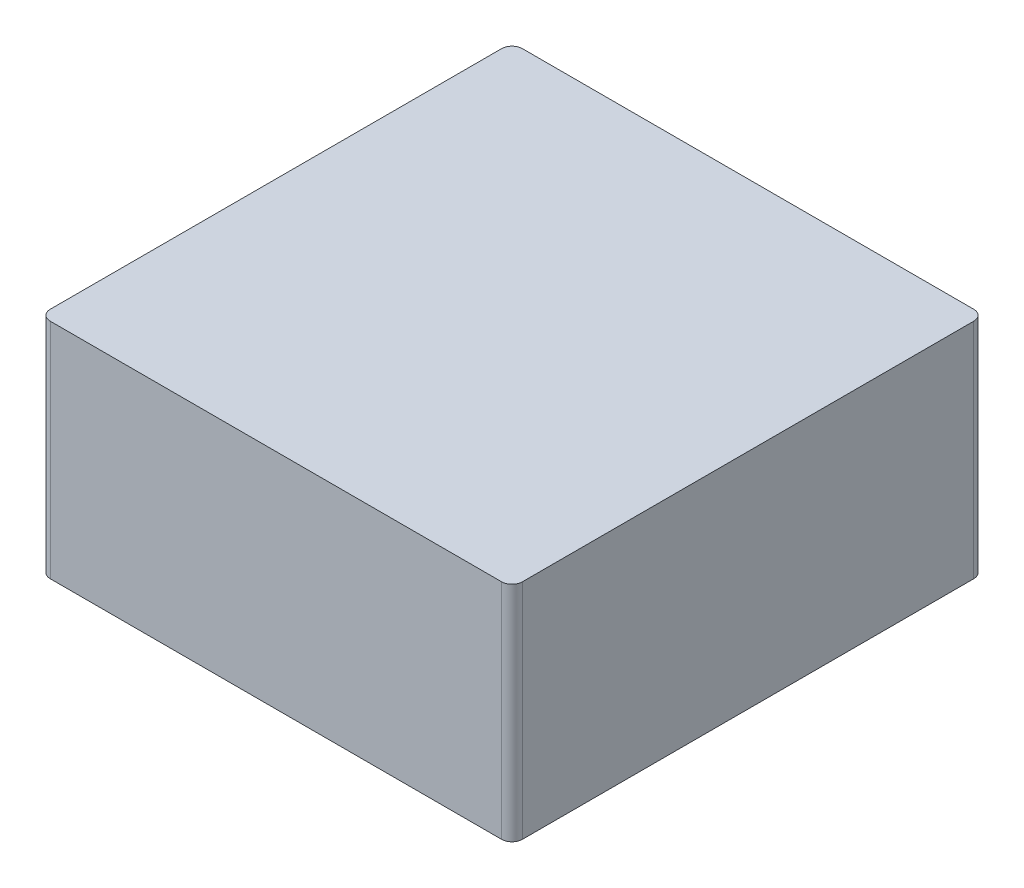
ISO-10303-21;
HEADER;
FILE_DESCRIPTION(('STEP AP214'),'2;1');
FILE_NAME('part.step','',(''),(''),'','','');
FILE_SCHEMA(('AUTOMOTIVE_DESIGN { 1 0 10303 214 1 1 1 1 }'));
ENDSEC;
DATA;
#1=APPLICATION_CONTEXT('core data for automotive mechanical design processes');
#2=APPLICATION_PROTOCOL_DEFINITION('international standard','automotive_design',2000,#1);
#3=PRODUCT_CONTEXT('',#1,'mechanical');
#4=PRODUCT('Part','Part','',(#3));
#5=PRODUCT_RELATED_PRODUCT_CATEGORY('part','',(#4));
#6=PRODUCT_DEFINITION_FORMATION('','',#4);
#7=PRODUCT_DEFINITION_CONTEXT('part definition',#1,'design');
#8=PRODUCT_DEFINITION('design','',#6,#7);
#9=PRODUCT_DEFINITION_SHAPE('','',#8);
#10=(LENGTH_UNIT() NAMED_UNIT(*) SI_UNIT(.MILLI.,.METRE.));
#11=(NAMED_UNIT(*) PLANE_ANGLE_UNIT() SI_UNIT($,.RADIAN.));
#12=(NAMED_UNIT(*) SI_UNIT($,.STERADIAN.) SOLID_ANGLE_UNIT());
#13=UNCERTAINTY_MEASURE_WITH_UNIT(LENGTH_MEASURE(1.E-05),#10,'distance_accuracy_value','');
#14=(GEOMETRIC_REPRESENTATION_CONTEXT(3) GLOBAL_UNCERTAINTY_ASSIGNED_CONTEXT((#13)) GLOBAL_UNIT_ASSIGNED_CONTEXT((#10,
#11,#12)) REPRESENTATION_CONTEXT('',''));
#15=CARTESIAN_POINT('',(0.,0.,0.));
#16=DIRECTION('',(0.,0.,1.));
#17=DIRECTION('',(1.,0.,0.));
#18=AXIS2_PLACEMENT_3D('',#15,#16,#17);
#19=CARTESIAN_POINT('',(0.,0.,0.));
#20=DIRECTION('',(0.,1.,0.));
#21=DIRECTION('',(0.,0.,1.));
#22=AXIS2_PLACEMENT_3D('',#19,#20,#21);
#23=PLANE('',#22);
#24=DIRECTION('',(0.,0.,1.));
#25=VECTOR('',#24,1.);
#26=CARTESIAN_POINT('',(-88.,0.,-88.));
#27=LINE('',#26,#25);
#28=CARTESIAN_POINT('',(-88.,0.,-86.));
#29=VERTEX_POINT('',#28);
#30=CARTESIAN_POINT('',(-88.,0.,1.));
#31=VERTEX_POINT('',#30);
#32=EDGE_CURVE('E258',#29,#31,#27,.T.);
#33=ORIENTED_EDGE('',*,*,#32,.F.);
#34=CARTESIAN_POINT('',(-86.,0.,-86.));
#35=DIRECTION('',(0.,1.,0.));
#36=DIRECTION('',(0.,0.,1.));
#37=AXIS2_PLACEMENT_3D('',#34,#35,#36);
#38=CIRCLE('',#37,2.);
#39=CARTESIAN_POINT('',(-86.,0.,-88.));
#40=VERTEX_POINT('',#39);
#41=EDGE_CURVE('E442',#29,#40,#38,.F.);
#42=ORIENTED_EDGE('',*,*,#41,.T.);
#43=DIRECTION('',(-1.,0.,0.));
#44=VECTOR('',#43,1.);
#45=CARTESIAN_POINT('',(3.,0.,-88.));
#46=LINE('',#45,#44);
#47=CARTESIAN_POINT('',(1.,0.,-88.));
#48=VERTEX_POINT('',#47);
#49=EDGE_CURVE('E190',#48,#40,#46,.T.);
#50=ORIENTED_EDGE('',*,*,#49,.F.);
#51=CARTESIAN_POINT('',(1.,0.,-86.));
#52=DIRECTION('',(0.,1.,0.));
#53=DIRECTION('',(0.,0.,1.));
#54=AXIS2_PLACEMENT_3D('',#51,#52,#53);
#55=CIRCLE('',#54,2.);
#56=CARTESIAN_POINT('',(3.,0.,-86.));
#57=VERTEX_POINT('',#56);
#58=EDGE_CURVE('E445',#48,#57,#55,.F.);
#59=ORIENTED_EDGE('',*,*,#58,.T.);
#60=DIRECTION('',(0.,0.,-1.));
#61=VECTOR('',#60,1.);
#62=CARTESIAN_POINT('',(3.,0.,3.));
#63=LINE('',#62,#61);
#64=CARTESIAN_POINT('',(3.,0.,1.));
#65=VERTEX_POINT('',#64);
#66=EDGE_CURVE('E269',#65,#57,#63,.T.);
#67=ORIENTED_EDGE('',*,*,#66,.F.);
#68=CARTESIAN_POINT('',(1.,0.,1.));
#69=DIRECTION('',(0.,1.,0.));
#70=DIRECTION('',(0.,0.,1.));
#71=AXIS2_PLACEMENT_3D('',#68,#69,#70);
#72=CIRCLE('',#71,2.);
#73=CARTESIAN_POINT('',(1.,0.,3.));
#74=VERTEX_POINT('',#73);
#75=EDGE_CURVE('E448',#65,#74,#72,.F.);
#76=ORIENTED_EDGE('',*,*,#75,.T.);
#77=DIRECTION('',(1.,0.,0.));
#78=VECTOR('',#77,1.);
#79=CARTESIAN_POINT('',(-88.,0.,3.));
#80=LINE('',#79,#78);
#81=CARTESIAN_POINT('',(-86.,0.,3.));
#82=VERTEX_POINT('',#81);
#83=EDGE_CURVE('E263',#82,#74,#80,.T.);
#84=ORIENTED_EDGE('',*,*,#83,.F.);
#85=CARTESIAN_POINT('',(-86.,0.,1.));
#86=DIRECTION('',(0.,1.,0.));
#87=DIRECTION('',(0.,0.,1.));
#88=AXIS2_PLACEMENT_3D('',#85,#86,#87);
#89=CIRCLE('',#88,2.);
#90=EDGE_CURVE('E451',#82,#31,#89,.F.);
#91=ORIENTED_EDGE('',*,*,#90,.T.);
#92=EDGE_LOOP('',(#33,#42,#50,#59,#67,#76,#84,#91));
#93=FACE_BOUND('',#92,.T.);
#94=DIRECTION('',(1.,0.,0.));
#95=VECTOR('',#94,1.);
#96=CARTESIAN_POINT('',(-85.,0.,0.));
#97=LINE('',#96,#95);
#98=CARTESIAN_POINT('',(-85.,0.,0.));
#99=VERTEX_POINT('',#98);
#100=CARTESIAN_POINT('',(0.,0.,0.));
#101=VERTEX_POINT('',#100);
#102=EDGE_CURVE('E215',#99,#101,#97,.T.);
#103=ORIENTED_EDGE('',*,*,#102,.T.);
#104=DIRECTION('',(0.,0.,-1.));
#105=VECTOR('',#104,1.);
#106=CARTESIAN_POINT('',(0.,0.,0.));
#107=LINE('',#106,#105);
#108=CARTESIAN_POINT('',(0.,0.,-85.));
#109=VERTEX_POINT('',#108);
#110=EDGE_CURVE('E237',#101,#109,#107,.T.);
#111=ORIENTED_EDGE('',*,*,#110,.T.);
#112=DIRECTION('',(-1.,0.,0.));
#113=VECTOR('',#112,1.);
#114=CARTESIAN_POINT('',(0.,0.,-85.));
#115=LINE('',#114,#113);
#116=CARTESIAN_POINT('',(-85.,0.,-85.));
#117=VERTEX_POINT('',#116);
#118=EDGE_CURVE('E184',#109,#117,#115,.T.);
#119=ORIENTED_EDGE('',*,*,#118,.T.);
#120=DIRECTION('',(0.,0.,1.));
#121=VECTOR('',#120,1.);
#122=CARTESIAN_POINT('',(-85.,0.,-85.));
#123=LINE('',#122,#121);
#124=EDGE_CURVE('E221',#117,#99,#123,.T.);
#125=ORIENTED_EDGE('',*,*,#124,.T.);
#126=EDGE_LOOP('',(#103,#111,#119,#125));
#127=FACE_BOUND('',#126,.T.);
#128=ADVANCED_FACE('F45',(#93,#127),#23,.F.);
#129=CARTESIAN_POINT('',(3.,40.,-88.));
#130=DIRECTION('',(0.,0.,1.));
#131=DIRECTION('',(1.,0.,0.));
#132=AXIS2_PLACEMENT_3D('',#129,#130,#131);
#133=PLANE('',#132);
#134=ORIENTED_EDGE('',*,*,#49,.T.);
#135=DIRECTION('',(0.,-1.,0.));
#136=VECTOR('',#135,1.);
#137=CARTESIAN_POINT('',(-86.,40.,-88.));
#138=LINE('',#137,#136);
#139=CARTESIAN_POINT('',(-86.,43.,-88.));
#140=VERTEX_POINT('',#139);
#141=EDGE_CURVE('E433',#40,#140,#138,.F.);
#142=ORIENTED_EDGE('',*,*,#141,.T.);
#143=DIRECTION('',(1.,0.,0.));
#144=VECTOR('',#143,1.);
#145=CARTESIAN_POINT('',(-88.,43.,-88.));
#146=LINE('',#145,#144);
#147=CARTESIAN_POINT('',(1.,43.,-88.));
#148=VERTEX_POINT('',#147);
#149=EDGE_CURVE('E295',#140,#148,#146,.T.);
#150=ORIENTED_EDGE('',*,*,#149,.T.);
#151=DIRECTION('',(0.,-1.,0.));
#152=VECTOR('',#151,1.);
#153=CARTESIAN_POINT('',(1.,40.,-88.));
#154=LINE('',#153,#152);
#155=EDGE_CURVE('E437',#148,#48,#154,.T.);
#156=ORIENTED_EDGE('',*,*,#155,.T.);
#157=EDGE_LOOP('',(#134,#142,#150,#156));
#158=FACE_BOUND('',#157,.T.);
#159=ADVANCED_FACE('F374',(#158),#133,.F.);
#160=CARTESIAN_POINT('',(-88.,40.,-88.));
#161=DIRECTION('',(1.,0.,0.));
#162=DIRECTION('',(0.,0.,-1.));
#163=AXIS2_PLACEMENT_3D('',#160,#161,#162);
#164=PLANE('',#163);
#165=DIRECTION('',(0.,0.,1.));
#166=VECTOR('',#165,1.);
#167=CARTESIAN_POINT('',(-88.,43.,-88.));
#168=LINE('',#167,#166);
#169=CARTESIAN_POINT('',(-88.,43.,-86.));
#170=VERTEX_POINT('',#169);
#171=CARTESIAN_POINT('',(-88.,43.,1.));
#172=VERTEX_POINT('',#171);
#173=EDGE_CURVE('E209',#170,#172,#168,.T.);
#174=ORIENTED_EDGE('',*,*,#173,.F.);
#175=DIRECTION('',(0.,-1.,0.));
#176=VECTOR('',#175,1.);
#177=CARTESIAN_POINT('',(-88.,40.,-86.));
#178=LINE('',#177,#176);
#179=EDGE_CURVE('E453',#170,#29,#178,.T.);
#180=ORIENTED_EDGE('',*,*,#179,.T.);
#181=ORIENTED_EDGE('',*,*,#32,.T.);
#182=DIRECTION('',(0.,-1.,0.));
#183=VECTOR('',#182,1.);
#184=CARTESIAN_POINT('',(-88.,40.,1.));
#185=LINE('',#184,#183);
#186=EDGE_CURVE('E457',#31,#172,#185,.F.);
#187=ORIENTED_EDGE('',*,*,#186,.T.);
#188=EDGE_LOOP('',(#174,#180,#181,#187));
#189=FACE_BOUND('',#188,.T.);
#190=ADVANCED_FACE('F380',(#189),#164,.F.);
#191=CARTESIAN_POINT('',(-88.,40.,3.));
#192=DIRECTION('',(0.,0.,-1.));
#193=DIRECTION('',(-1.,0.,0.));
#194=AXIS2_PLACEMENT_3D('',#191,#192,#193);
#195=PLANE('',#194);
#196=ORIENTED_EDGE('',*,*,#83,.T.);
#197=DIRECTION('',(0.,-1.,0.));
#198=VECTOR('',#197,1.);
#199=CARTESIAN_POINT('',(1.,40.,3.));
#200=LINE('',#199,#198);
#201=CARTESIAN_POINT('',(1.,43.,3.));
#202=VERTEX_POINT('',#201);
#203=EDGE_CURVE('E12',#74,#202,#200,.F.);
#204=ORIENTED_EDGE('',*,*,#203,.T.);
#205=DIRECTION('',(1.,0.,0.));
#206=VECTOR('',#205,1.);
#207=CARTESIAN_POINT('',(-88.,43.,3.));
#208=LINE('',#207,#206);
#209=CARTESIAN_POINT('',(-86.,43.,3.));
#210=VERTEX_POINT('',#209);
#211=EDGE_CURVE('E216',#210,#202,#208,.T.);
#212=ORIENTED_EDGE('',*,*,#211,.F.);
#213=DIRECTION('',(0.,-1.,0.));
#214=VECTOR('',#213,1.);
#215=CARTESIAN_POINT('',(-86.,40.,3.));
#216=LINE('',#215,#214);
#217=EDGE_CURVE('E55',#210,#82,#216,.T.);
#218=ORIENTED_EDGE('',*,*,#217,.T.);
#219=EDGE_LOOP('',(#196,#204,#212,#218));
#220=FACE_BOUND('',#219,.T.);
#221=ADVANCED_FACE('F399',(#220),#195,.F.);
#222=CARTESIAN_POINT('',(3.,40.,3.));
#223=DIRECTION('',(-1.,0.,0.));
#224=DIRECTION('',(0.,0.,1.));
#225=AXIS2_PLACEMENT_3D('',#222,#223,#224);
#226=PLANE('',#225);
#227=ORIENTED_EDGE('',*,*,#66,.T.);
#228=DIRECTION('',(0.,-1.,0.));
#229=VECTOR('',#228,1.);
#230=CARTESIAN_POINT('',(3.,40.,-86.));
#231=LINE('',#230,#229);
#232=CARTESIAN_POINT('',(3.,43.,-86.));
#233=VERTEX_POINT('',#232);
#234=EDGE_CURVE('E73',#57,#233,#231,.F.);
#235=ORIENTED_EDGE('',*,*,#234,.T.);
#236=DIRECTION('',(0.,0.,1.));
#237=VECTOR('',#236,1.);
#238=CARTESIAN_POINT('',(3.,43.,-88.));
#239=LINE('',#238,#237);
#240=CARTESIAN_POINT('',(3.,43.,1.));
#241=VERTEX_POINT('',#240);
#242=EDGE_CURVE('E292',#233,#241,#239,.T.);
#243=ORIENTED_EDGE('',*,*,#242,.T.);
#244=DIRECTION('',(0.,-1.,0.));
#245=VECTOR('',#244,1.);
#246=CARTESIAN_POINT('',(3.,40.,1.));
#247=LINE('',#246,#245);
#248=EDGE_CURVE('E284',#241,#65,#247,.T.);
#249=ORIENTED_EDGE('',*,*,#248,.T.);
#250=EDGE_LOOP('',(#227,#235,#243,#249));
#251=FACE_BOUND('',#250,.T.);
#252=ADVANCED_FACE('F394',(#251),#226,.F.);
#253=CARTESIAN_POINT('',(-85.,40.,0.));
#254=DIRECTION('',(0.,0.,-1.));
#255=DIRECTION('',(-1.,0.,0.));
#256=AXIS2_PLACEMENT_3D('',#253,#254,#255);
#257=PLANE('',#256);
#258=ORIENTED_EDGE('',*,*,#102,.F.);
#259=DIRECTION('',(0.,-1.,0.));
#260=VECTOR('',#259,1.);
#261=CARTESIAN_POINT('',(-85.,40.,0.));
#262=LINE('',#261,#260);
#263=CARTESIAN_POINT('',(-85.,40.,0.));
#264=VERTEX_POINT('',#263);
#265=EDGE_CURVE('E193',#264,#99,#262,.T.);
#266=ORIENTED_EDGE('',*,*,#265,.F.);
#267=DIRECTION('',(1.,0.,0.));
#268=VECTOR('',#267,1.);
#269=CARTESIAN_POINT('',(-85.,40.,0.));
#270=LINE('',#269,#268);
#271=CARTESIAN_POINT('',(0.,40.,0.));
#272=VERTEX_POINT('',#271);
#273=EDGE_CURVE('E180',#264,#272,#270,.T.);
#274=ORIENTED_EDGE('',*,*,#273,.T.);
#275=DIRECTION('',(0.,-1.,0.));
#276=VECTOR('',#275,1.);
#277=CARTESIAN_POINT('',(0.,40.,0.));
#278=LINE('',#277,#276);
#279=EDGE_CURVE('E178',#272,#101,#278,.T.);
#280=ORIENTED_EDGE('',*,*,#279,.T.);
#281=EDGE_LOOP('',(#258,#266,#274,#280));
#282=FACE_BOUND('',#281,.T.);
#283=ADVANCED_FACE('F391',(#282),#257,.T.);
#284=CARTESIAN_POINT('',(0.,40.,0.));
#285=DIRECTION('',(-1.,0.,0.));
#286=DIRECTION('',(0.,0.,1.));
#287=AXIS2_PLACEMENT_3D('',#284,#285,#286);
#288=PLANE('',#287);
#289=ORIENTED_EDGE('',*,*,#110,.F.);
#290=ORIENTED_EDGE('',*,*,#279,.F.);
#291=DIRECTION('',(0.,0.,-1.));
#292=VECTOR('',#291,1.);
#293=CARTESIAN_POINT('',(0.,40.,0.));
#294=LINE('',#293,#292);
#295=CARTESIAN_POINT('',(0.,40.,-85.));
#296=VERTEX_POINT('',#295);
#297=EDGE_CURVE('E163',#272,#296,#294,.T.);
#298=ORIENTED_EDGE('',*,*,#297,.T.);
#299=DIRECTION('',(0.,-1.,0.));
#300=VECTOR('',#299,1.);
#301=CARTESIAN_POINT('',(0.,40.,-85.));
#302=LINE('',#301,#300);
#303=EDGE_CURVE('E175',#296,#109,#302,.T.);
#304=ORIENTED_EDGE('',*,*,#303,.T.);
#305=EDGE_LOOP('',(#289,#290,#298,#304));
#306=FACE_BOUND('',#305,.T.);
#307=ADVANCED_FACE('F174',(#306),#288,.T.);
#308=CARTESIAN_POINT('',(0.,40.,-85.));
#309=DIRECTION('',(0.,0.,1.));
#310=DIRECTION('',(1.,0.,0.));
#311=AXIS2_PLACEMENT_3D('',#308,#309,#310);
#312=PLANE('',#311);
#313=ORIENTED_EDGE('',*,*,#118,.F.);
#314=ORIENTED_EDGE('',*,*,#303,.F.);
#315=DIRECTION('',(-1.,0.,0.));
#316=VECTOR('',#315,1.);
#317=CARTESIAN_POINT('',(0.,40.,-85.));
#318=LINE('',#317,#316);
#319=CARTESIAN_POINT('',(-85.,40.,-85.));
#320=VERTEX_POINT('',#319);
#321=EDGE_CURVE('E160',#296,#320,#318,.T.);
#322=ORIENTED_EDGE('',*,*,#321,.T.);
#323=DIRECTION('',(0.,-1.,0.));
#324=VECTOR('',#323,1.);
#325=CARTESIAN_POINT('',(-85.,40.,-85.));
#326=LINE('',#325,#324);
#327=EDGE_CURVE('E187',#320,#117,#326,.T.);
#328=ORIENTED_EDGE('',*,*,#327,.T.);
#329=EDGE_LOOP('',(#313,#314,#322,#328));
#330=FACE_BOUND('',#329,.T.);
#331=ADVANCED_FACE('F182',(#330),#312,.T.);
#332=CARTESIAN_POINT('',(-85.,40.,-85.));
#333=DIRECTION('',(1.,0.,0.));
#334=DIRECTION('',(0.,0.,-1.));
#335=AXIS2_PLACEMENT_3D('',#332,#333,#334);
#336=PLANE('',#335);
#337=ORIENTED_EDGE('',*,*,#124,.F.);
#338=ORIENTED_EDGE('',*,*,#327,.F.);
#339=DIRECTION('',(0.,0.,1.));
#340=VECTOR('',#339,1.);
#341=CARTESIAN_POINT('',(-85.,40.,-85.));
#342=LINE('',#341,#340);
#343=EDGE_CURVE('E166',#320,#264,#342,.T.);
#344=ORIENTED_EDGE('',*,*,#343,.T.);
#345=ORIENTED_EDGE('',*,*,#265,.T.);
#346=EDGE_LOOP('',(#337,#338,#344,#345));
#347=FACE_BOUND('',#346,.T.);
#348=ADVANCED_FACE('F349',(#347),#336,.T.);
#349=CARTESIAN_POINT('',(0.,40.,0.));
#350=DIRECTION('',(0.,-1.,0.));
#351=DIRECTION('',(0.,0.,-1.));
#352=AXIS2_PLACEMENT_3D('',#349,#350,#351);
#353=PLANE('',#352);
#354=CARTESIAN_POINT('',(-18.5,40.,-29.5));
#355=DIRECTION('',(0.,-1.,0.));
#356=DIRECTION('',(0.,0.,1.));
#357=AXIS2_PLACEMENT_3D('',#354,#355,#356);
#358=CIRCLE('',#357,2.50000000000001);
#359=CARTESIAN_POINT('',(-18.5,40.,-27.));
#360=VERTEX_POINT('',#359);
#361=EDGE_CURVE('E330',#360,#360,#358,.T.);
#362=ORIENTED_EDGE('',*,*,#361,.F.);
#363=EDGE_LOOP('',(#362));
#364=FACE_BOUND('',#363,.T.);
#365=CARTESIAN_POINT('',(-18.5,40.,-55.5));
#366=DIRECTION('',(0.,-1.,0.));
#367=DIRECTION('',(0.,0.,-1.));
#368=AXIS2_PLACEMENT_3D('',#365,#366,#367);
#369=CIRCLE('',#368,2.50000000000001);
#370=CARTESIAN_POINT('',(-18.5,40.,-58.));
#371=VERTEX_POINT('',#370);
#372=EDGE_CURVE('E321',#371,#371,#369,.T.);
#373=ORIENTED_EDGE('',*,*,#372,.F.);
#374=EDGE_LOOP('',(#373));
#375=FACE_BOUND('',#374,.T.);
#376=CARTESIAN_POINT('',(-66.5,40.,-55.5));
#377=DIRECTION('',(0.,-1.,0.));
#378=DIRECTION('',(0.,0.,1.));
#379=AXIS2_PLACEMENT_3D('',#376,#377,#378);
#380=CIRCLE('',#379,2.50000000000001);
#381=CARTESIAN_POINT('',(-66.5,40.,-53.));
#382=VERTEX_POINT('',#381);
#383=EDGE_CURVE('E312',#382,#382,#380,.T.);
#384=ORIENTED_EDGE('',*,*,#383,.F.);
#385=EDGE_LOOP('',(#384));
#386=FACE_BOUND('',#385,.T.);
#387=CARTESIAN_POINT('',(-66.5,40.,-29.5));
#388=DIRECTION('',(0.,-1.,0.));
#389=DIRECTION('',(0.,0.,-1.));
#390=AXIS2_PLACEMENT_3D('',#387,#388,#389);
#391=CIRCLE('',#390,2.50000000000001);
#392=CARTESIAN_POINT('',(-66.5,40.,-32.));
#393=VERTEX_POINT('',#392);
#394=EDGE_CURVE('E301',#393,#393,#391,.T.);
#395=ORIENTED_EDGE('',*,*,#394,.F.);
#396=EDGE_LOOP('',(#395));
#397=FACE_BOUND('',#396,.T.);
#398=ORIENTED_EDGE('',*,*,#297,.F.);
#399=ORIENTED_EDGE('',*,*,#273,.F.);
#400=ORIENTED_EDGE('',*,*,#343,.F.);
#401=ORIENTED_EDGE('',*,*,#321,.F.);
#402=EDGE_LOOP('',(#398,#399,#400,#401));
#403=FACE_BOUND('',#402,.T.);
#404=ADVANCED_FACE('F162',(#364,#375,#386,#397,#403),#353,.T.);
#405=CARTESIAN_POINT('',(0.,43.,0.));
#406=DIRECTION('',(0.,-1.,0.));
#407=DIRECTION('',(0.,0.,-1.));
#408=AXIS2_PLACEMENT_3D('',#405,#406,#407);
#409=PLANE('',#408);
#410=ORIENTED_EDGE('',*,*,#149,.F.);
#411=CARTESIAN_POINT('',(-86.,43.,-86.));
#412=DIRECTION('',(0.,-1.,0.));
#413=DIRECTION('',(0.,0.,-1.));
#414=AXIS2_PLACEMENT_3D('',#411,#412,#413);
#415=CIRCLE('',#414,2.);
#416=EDGE_CURVE('E289',#140,#170,#415,.F.);
#417=ORIENTED_EDGE('',*,*,#416,.T.);
#418=ORIENTED_EDGE('',*,*,#173,.T.);
#419=CARTESIAN_POINT('',(-86.,43.,1.));
#420=DIRECTION('',(0.,-1.,0.));
#421=DIRECTION('',(0.,0.,-1.));
#422=AXIS2_PLACEMENT_3D('',#419,#420,#421);
#423=CIRCLE('',#422,2.);
#424=EDGE_CURVE('E429',#172,#210,#423,.F.);
#425=ORIENTED_EDGE('',*,*,#424,.T.);
#426=ORIENTED_EDGE('',*,*,#211,.T.);
#427=CARTESIAN_POINT('',(1.,43.,1.));
#428=DIRECTION('',(0.,-1.,0.));
#429=DIRECTION('',(0.,0.,-1.));
#430=AXIS2_PLACEMENT_3D('',#427,#428,#429);
#431=CIRCLE('',#430,2.);
#432=EDGE_CURVE('E65',#202,#241,#431,.F.);
#433=ORIENTED_EDGE('',*,*,#432,.T.);
#434=ORIENTED_EDGE('',*,*,#242,.F.);
#435=CARTESIAN_POINT('',(1.,43.,-86.));
#436=DIRECTION('',(0.,-1.,0.));
#437=DIRECTION('',(0.,0.,-1.));
#438=AXIS2_PLACEMENT_3D('',#435,#436,#437);
#439=CIRCLE('',#438,2.);
#440=EDGE_CURVE('E428',#233,#148,#439,.F.);
#441=ORIENTED_EDGE('',*,*,#440,.T.);
#442=EDGE_LOOP('',(#410,#417,#418,#425,#426,#433,#434,#441));
#443=FACE_BOUND('',#442,.T.);
#444=ADVANCED_FACE('F348',(#443),#409,.F.);
#445=CARTESIAN_POINT('',(-86.,40.,-86.));
#446=DIRECTION('',(0.,-1.,0.));
#447=DIRECTION('',(0.,0.,-1.));
#448=AXIS2_PLACEMENT_3D('',#445,#446,#447);
#449=CYLINDRICAL_SURFACE('',#448,2.);
#450=ORIENTED_EDGE('',*,*,#416,.F.);
#451=ORIENTED_EDGE('',*,*,#141,.F.);
#452=ORIENTED_EDGE('',*,*,#41,.F.);
#453=ORIENTED_EDGE('',*,*,#179,.F.);
#454=EDGE_LOOP('',(#450,#451,#452,#453));
#455=FACE_BOUND('',#454,.T.);
#456=ADVANCED_FACE('F412',(#455),#449,.T.);
#457=CARTESIAN_POINT('',(1.,40.,-86.));
#458=DIRECTION('',(0.,-1.,0.));
#459=DIRECTION('',(0.,0.,-1.));
#460=AXIS2_PLACEMENT_3D('',#457,#458,#459);
#461=CYLINDRICAL_SURFACE('',#460,2.);
#462=ORIENTED_EDGE('',*,*,#440,.F.);
#463=ORIENTED_EDGE('',*,*,#234,.F.);
#464=ORIENTED_EDGE('',*,*,#58,.F.);
#465=ORIENTED_EDGE('',*,*,#155,.F.);
#466=EDGE_LOOP('',(#462,#463,#464,#465));
#467=FACE_BOUND('',#466,.T.);
#468=ADVANCED_FACE('F416',(#467),#461,.T.);
#469=CARTESIAN_POINT('',(1.,40.,1.));
#470=DIRECTION('',(0.,-1.,0.));
#471=DIRECTION('',(0.,0.,-1.));
#472=AXIS2_PLACEMENT_3D('',#469,#470,#471);
#473=CYLINDRICAL_SURFACE('',#472,2.);
#474=ORIENTED_EDGE('',*,*,#432,.F.);
#475=ORIENTED_EDGE('',*,*,#203,.F.);
#476=ORIENTED_EDGE('',*,*,#75,.F.);
#477=ORIENTED_EDGE('',*,*,#248,.F.);
#478=EDGE_LOOP('',(#474,#475,#476,#477));
#479=FACE_BOUND('',#478,.T.);
#480=ADVANCED_FACE('F368',(#479),#473,.T.);
#481=CARTESIAN_POINT('',(-86.,40.,1.));
#482=DIRECTION('',(0.,-1.,0.));
#483=DIRECTION('',(0.,0.,-1.));
#484=AXIS2_PLACEMENT_3D('',#481,#482,#483);
#485=CYLINDRICAL_SURFACE('',#484,2.);
#486=ORIENTED_EDGE('',*,*,#424,.F.);
#487=ORIENTED_EDGE('',*,*,#186,.F.);
#488=ORIENTED_EDGE('',*,*,#90,.F.);
#489=ORIENTED_EDGE('',*,*,#217,.F.);
#490=EDGE_LOOP('',(#486,#487,#488,#489));
#491=FACE_BOUND('',#490,.T.);
#492=ADVANCED_FACE('F48',(#491),#485,.T.);
#493=CARTESIAN_POINT('',(-66.5,37.,-29.5));
#494=DIRECTION('',(0.,1.,0.));
#495=DIRECTION('',(0.,0.,1.));
#496=AXIS2_PLACEMENT_3D('',#493,#494,#495);
#497=CYLINDRICAL_SURFACE('',#496,2.50000000000001);
#498=CARTESIAN_POINT('',(-66.5,37.,-29.5));
#499=DIRECTION('',(0.,-1.,0.));
#500=DIRECTION('',(0.,0.,-1.));
#501=AXIS2_PLACEMENT_3D('',#498,#499,#500);
#502=CIRCLE('',#501,2.50000000000001);
#503=CARTESIAN_POINT('',(-66.5,37.,-32.));
#504=VERTEX_POINT('',#503);
#505=EDGE_CURVE('E300',#504,#504,#502,.T.);
#506=ORIENTED_EDGE('',*,*,#505,.F.);
#507=EDGE_LOOP('',(#506));
#508=FACE_BOUND('',#507,.T.);
#509=ORIENTED_EDGE('',*,*,#394,.T.);
#510=EDGE_LOOP('',(#509));
#511=FACE_BOUND('',#510,.T.);
#512=ADVANCED_FACE('F356',(#508,#511),#497,.T.);
#513=CARTESIAN_POINT('',(-66.5,37.,-29.5));
#514=DIRECTION('',(0.,-1.,0.));
#515=DIRECTION('',(0.,0.,-1.));
#516=AXIS2_PLACEMENT_3D('',#513,#514,#515);
#517=PLANE('',#516);
#518=ORIENTED_EDGE('',*,*,#505,.T.);
#519=EDGE_LOOP('',(#518));
#520=FACE_BOUND('',#519,.T.);
#521=ADVANCED_FACE('F358',(#520),#517,.T.);
#522=CARTESIAN_POINT('',(-66.5,37.,-55.5));
#523=DIRECTION('',(0.,1.,0.));
#524=DIRECTION('',(0.,0.,1.));
#525=AXIS2_PLACEMENT_3D('',#522,#523,#524);
#526=CYLINDRICAL_SURFACE('',#525,2.50000000000001);
#527=CARTESIAN_POINT('',(-66.5,37.,-55.5));
#528=DIRECTION('',(0.,-1.,0.));
#529=DIRECTION('',(0.,0.,1.));
#530=AXIS2_PLACEMENT_3D('',#527,#528,#529);
#531=CIRCLE('',#530,2.50000000000001);
#532=CARTESIAN_POINT('',(-66.5,37.,-53.));
#533=VERTEX_POINT('',#532);
#534=EDGE_CURVE('E305',#533,#533,#531,.T.);
#535=ORIENTED_EDGE('',*,*,#534,.F.);
#536=EDGE_LOOP('',(#535));
#537=FACE_BOUND('',#536,.T.);
#538=ORIENTED_EDGE('',*,*,#383,.T.);
#539=EDGE_LOOP('',(#538));
#540=FACE_BOUND('',#539,.T.);
#541=ADVANCED_FACE('F365',(#537,#540),#526,.T.);
#542=CARTESIAN_POINT('',(-66.5,37.,-55.5));
#543=DIRECTION('',(0.,1.,0.));
#544=DIRECTION('',(0.,0.,1.));
#545=AXIS2_PLACEMENT_3D('',#542,#543,#544);
#546=PLANE('',#545);
#547=ORIENTED_EDGE('',*,*,#534,.T.);
#548=EDGE_LOOP('',(#547));
#549=FACE_BOUND('',#548,.T.);
#550=ADVANCED_FACE('F617',(#549),#546,.F.);
#551=CARTESIAN_POINT('',(-18.5,37.,-55.5));
#552=DIRECTION('',(0.,1.,0.));
#553=DIRECTION('',(0.,0.,1.));
#554=AXIS2_PLACEMENT_3D('',#551,#552,#553);
#555=CYLINDRICAL_SURFACE('',#554,2.50000000000001);
#556=CARTESIAN_POINT('',(-18.5,37.,-55.5));
#557=DIRECTION('',(0.,-1.,0.));
#558=DIRECTION('',(0.,0.,-1.));
#559=AXIS2_PLACEMENT_3D('',#556,#557,#558);
#560=CIRCLE('',#559,2.50000000000001);
#561=CARTESIAN_POINT('',(-18.5,37.,-58.));
#562=VERTEX_POINT('',#561);
#563=EDGE_CURVE('E317',#562,#562,#560,.T.);
#564=ORIENTED_EDGE('',*,*,#563,.F.);
#565=EDGE_LOOP('',(#564));
#566=FACE_BOUND('',#565,.T.);
#567=ORIENTED_EDGE('',*,*,#372,.T.);
#568=EDGE_LOOP('',(#567));
#569=FACE_BOUND('',#568,.T.);
#570=ADVANCED_FACE('F344',(#566,#569),#555,.T.);
#571=CARTESIAN_POINT('',(-18.5,37.,-55.5));
#572=DIRECTION('',(0.,-1.,0.));
#573=DIRECTION('',(0.,0.,-1.));
#574=AXIS2_PLACEMENT_3D('',#571,#572,#573);
#575=PLANE('',#574);
#576=ORIENTED_EDGE('',*,*,#563,.T.);
#577=EDGE_LOOP('',(#576));
#578=FACE_BOUND('',#577,.T.);
#579=ADVANCED_FACE('F636',(#578),#575,.T.);
#580=CARTESIAN_POINT('',(-18.5,37.,-29.5));
#581=DIRECTION('',(0.,1.,0.));
#582=DIRECTION('',(0.,0.,1.));
#583=AXIS2_PLACEMENT_3D('',#580,#581,#582);
#584=CYLINDRICAL_SURFACE('',#583,2.50000000000001);
#585=CARTESIAN_POINT('',(-18.5,37.,-29.5));
#586=DIRECTION('',(0.,-1.,0.));
#587=DIRECTION('',(0.,0.,1.));
#588=AXIS2_PLACEMENT_3D('',#585,#586,#587);
#589=CIRCLE('',#588,2.50000000000001);
#590=CARTESIAN_POINT('',(-18.5,37.,-27.));
#591=VERTEX_POINT('',#590);
#592=EDGE_CURVE('E334',#591,#591,#589,.T.);
#593=ORIENTED_EDGE('',*,*,#592,.F.);
#594=EDGE_LOOP('',(#593));
#595=FACE_BOUND('',#594,.T.);
#596=ORIENTED_EDGE('',*,*,#361,.T.);
#597=EDGE_LOOP('',(#596));
#598=FACE_BOUND('',#597,.T.);
#599=ADVANCED_FACE('F646',(#595,#598),#584,.T.);
#600=CARTESIAN_POINT('',(-18.5,37.,-29.5));
#601=DIRECTION('',(0.,1.,0.));
#602=DIRECTION('',(0.,0.,1.));
#603=AXIS2_PLACEMENT_3D('',#600,#601,#602);
#604=PLANE('',#603);
#605=ORIENTED_EDGE('',*,*,#592,.T.);
#606=EDGE_LOOP('',(#605));
#607=FACE_BOUND('',#606,.T.);
#608=ADVANCED_FACE('F656',(#607),#604,.F.);
#609=CLOSED_SHELL('',(#128,#159,#190,#221,#252,#283,#307,#331,#348,#404,#444,#456,#468,#480,
#492,#512,#521,#541,#550,#570,#579,#599,#608));
#610=MANIFOLD_SOLID_BREP('B2',#609);
#611=ADVANCED_BREP_SHAPE_REPRESENTATION('',(#18,#610),#14);
#612=SHAPE_DEFINITION_REPRESENTATION(#9,#611);
ENDSEC;
END-ISO-10303-21;
